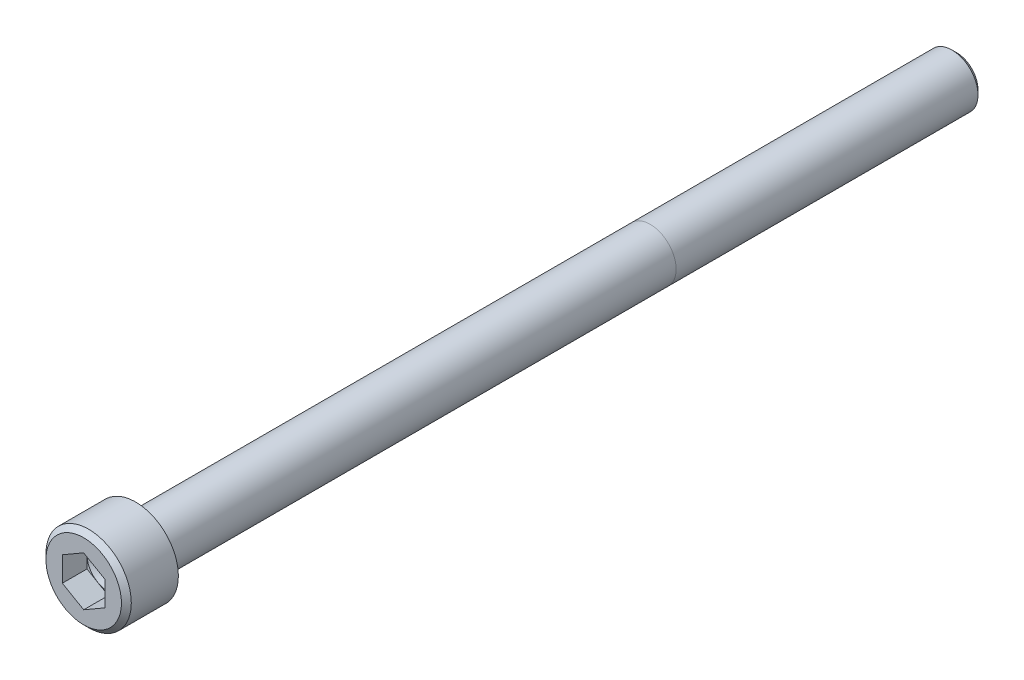
ISO-10303-21;
HEADER;
FILE_DESCRIPTION(('STEP AP214'),'2;1');
FILE_NAME('part.step','',(''),(''),'','','');
FILE_SCHEMA(('AUTOMOTIVE_DESIGN { 1 0 10303 214 1 1 1 1 }'));
ENDSEC;
DATA;
#1=APPLICATION_CONTEXT('core data for automotive mechanical design processes');
#2=APPLICATION_PROTOCOL_DEFINITION('international standard','automotive_design',2000,#1);
#3=PRODUCT_CONTEXT('',#1,'mechanical');
#4=PRODUCT('Part','Part','',(#3));
#5=PRODUCT_RELATED_PRODUCT_CATEGORY('part','',(#4));
#6=PRODUCT_DEFINITION_FORMATION('','',#4);
#7=PRODUCT_DEFINITION_CONTEXT('part definition',#1,'design');
#8=PRODUCT_DEFINITION('design','',#6,#7);
#9=PRODUCT_DEFINITION_SHAPE('','',#8);
#10=(LENGTH_UNIT() NAMED_UNIT(*) SI_UNIT(.MILLI.,.METRE.));
#11=(NAMED_UNIT(*) PLANE_ANGLE_UNIT() SI_UNIT($,.RADIAN.));
#12=(NAMED_UNIT(*) SI_UNIT($,.STERADIAN.) SOLID_ANGLE_UNIT());
#13=UNCERTAINTY_MEASURE_WITH_UNIT(LENGTH_MEASURE(1.E-05),#10,'distance_accuracy_value','');
#14=(GEOMETRIC_REPRESENTATION_CONTEXT(3) GLOBAL_UNCERTAINTY_ASSIGNED_CONTEXT((#13)) GLOBAL_UNIT_ASSIGNED_CONTEXT((#10,
#11,#12)) REPRESENTATION_CONTEXT('',''));
#15=CARTESIAN_POINT('',(0.,0.,0.));
#16=DIRECTION('',(0.,0.,1.));
#17=DIRECTION('',(1.,0.,0.));
#18=AXIS2_PLACEMENT_3D('',#15,#16,#17);
#19=CARTESIAN_POINT('',(0.,0.,-76.2));
#20=DIRECTION('',(0.,0.,1.));
#21=DIRECTION('',(1.,0.,0.));
#22=AXIS2_PLACEMENT_3D('',#19,#20,#21);
#23=CYLINDRICAL_SURFACE('',#22,2.413);
#24=CARTESIAN_POINT('',(0.,0.,-0.152399999999997));
#25=DIRECTION('',(0.,0.,1.));
#26=DIRECTION('',(1.,0.,0.));
#27=AXIS2_PLACEMENT_3D('',#24,#25,#26);
#28=CIRCLE('',#27,2.413);
#29=CARTESIAN_POINT('',(2.413,0.,-0.152399999999997));
#30=VERTEX_POINT('',#29);
#31=EDGE_CURVE('E137',#30,#30,#28,.F.);
#32=ORIENTED_EDGE('',*,*,#31,.T.);
#33=EDGE_LOOP('',(#32));
#34=FACE_BOUND('',#33,.T.);
#35=CARTESIAN_POINT('',(0.,0.,-47.752));
#36=DIRECTION('',(0.,0.,-1.));
#37=DIRECTION('',(-1.,0.,0.));
#38=AXIS2_PLACEMENT_3D('',#35,#36,#37);
#39=CIRCLE('',#38,2.413);
#40=CARTESIAN_POINT('',(-2.413,0.,-47.752));
#41=VERTEX_POINT('',#40);
#42=EDGE_CURVE('E11',#41,#41,#39,.T.);
#43=ORIENTED_EDGE('',*,*,#42,.F.);
#44=EDGE_LOOP('',(#43));
#45=FACE_BOUND('',#44,.T.);
#46=ADVANCED_FACE('F17',(#34,#45),#23,.T.);
#47=CARTESIAN_POINT('',(0.,0.,2.54));
#48=DIRECTION('',(0.,0.,1.));
#49=DIRECTION('',(1.,0.,0.));
#50=AXIS2_PLACEMENT_3D('',#47,#48,#49);
#51=PLANE('',#50);
#52=DIRECTION('',(0.,1.,0.));
#53=VECTOR('',#52,1.);
#54=CARTESIAN_POINT('',(-1.9812,0.,2.54));
#55=LINE('',#54,#53);
#56=CARTESIAN_POINT('',(-1.9812,0.,2.54));
#57=VERTEX_POINT('',#56);
#58=CARTESIAN_POINT('',(-1.9812,1.14384635331849,2.54));
#59=VERTEX_POINT('',#58);
#60=EDGE_CURVE('E194',#57,#59,#55,.T.);
#61=ORIENTED_EDGE('',*,*,#60,.F.);
#62=CARTESIAN_POINT('',(0.,0.,2.54));
#63=DIRECTION('',(0.,0.,-1.));
#64=DIRECTION('',(-1.,0.,0.));
#65=AXIS2_PLACEMENT_3D('',#62,#63,#64);
#66=CIRCLE('',#65,1.9812);
#67=CARTESIAN_POINT('',(-0.9906,1.71576952997773,2.54));
#68=VERTEX_POINT('',#67);
#69=EDGE_CURVE('E32',#57,#68,#66,.T.);
#70=ORIENTED_EDGE('',*,*,#69,.T.);
#71=DIRECTION('',(0.866025403784439,0.5,0.));
#72=VECTOR('',#71,1.);
#73=CARTESIAN_POINT('',(0.163354175866616,2.38200528404682,2.54));
#74=LINE('',#73,#72);
#75=EDGE_CURVE('E195',#59,#68,#74,.T.);
#76=ORIENTED_EDGE('',*,*,#75,.F.);
#77=EDGE_LOOP('',(#61,#70,#76));
#78=FACE_BOUND('',#77,.T.);
#79=ADVANCED_FACE('F105',(#78),#51,.T.);
#80=CARTESIAN_POINT('',(0.,2.28769270663697,2.54));
#81=VERTEX_POINT('',#80);
#82=EDGE_CURVE('E198',#68,#81,#74,.T.);
#83=ORIENTED_EDGE('',*,*,#82,.F.);
#84=CARTESIAN_POINT('',(0.9906,1.71576952997773,2.54));
#85=VERTEX_POINT('',#84);
#86=EDGE_CURVE('E139',#68,#85,#66,.T.);
#87=ORIENTED_EDGE('',*,*,#86,.T.);
#88=DIRECTION('',(0.866025403784439,-0.5,0.));
#89=VECTOR('',#88,1.);
#90=CARTESIAN_POINT('',(-0.163354175866613,2.38200528404682,2.54));
#91=LINE('',#90,#89);
#92=EDGE_CURVE('E199',#81,#85,#91,.T.);
#93=ORIENTED_EDGE('',*,*,#92,.F.);
#94=EDGE_LOOP('',(#83,#87,#93));
#95=FACE_BOUND('',#94,.T.);
#96=ADVANCED_FACE('F111',(#95),#51,.T.);
#97=CARTESIAN_POINT('',(1.9812,1.14384635331848,2.54));
#98=VERTEX_POINT('',#97);
#99=EDGE_CURVE('E166',#85,#98,#91,.T.);
#100=ORIENTED_EDGE('',*,*,#99,.F.);
#101=CARTESIAN_POINT('',(1.9812,0.,2.54));
#102=VERTEX_POINT('',#101);
#103=EDGE_CURVE('E206',#85,#102,#66,.T.);
#104=ORIENTED_EDGE('',*,*,#103,.T.);
#105=DIRECTION('',(0.,-1.,0.));
#106=VECTOR('',#105,1.);
#107=CARTESIAN_POINT('',(1.9812,0.,2.54));
#108=LINE('',#107,#106);
#109=EDGE_CURVE('E162',#98,#102,#108,.T.);
#110=ORIENTED_EDGE('',*,*,#109,.F.);
#111=EDGE_LOOP('',(#100,#104,#110));
#112=FACE_BOUND('',#111,.T.);
#113=ADVANCED_FACE('F223',(#112),#51,.T.);
#114=CARTESIAN_POINT('',(1.9812,-1.14384635331848,2.54));
#115=VERTEX_POINT('',#114);
#116=EDGE_CURVE('E182',#102,#115,#108,.T.);
#117=ORIENTED_EDGE('',*,*,#116,.F.);
#118=CARTESIAN_POINT('',(0.9906,-1.71576952997773,2.54));
#119=VERTEX_POINT('',#118);
#120=EDGE_CURVE('E211',#102,#119,#66,.T.);
#121=ORIENTED_EDGE('',*,*,#120,.T.);
#122=DIRECTION('',(-0.866025403784438,-0.5,0.));
#123=VECTOR('',#122,1.);
#124=CARTESIAN_POINT('',(2.14455417586661,-1.04953377590864,2.54));
#125=LINE('',#124,#123);
#126=EDGE_CURVE('E183',#115,#119,#125,.T.);
#127=ORIENTED_EDGE('',*,*,#126,.F.);
#128=EDGE_LOOP('',(#117,#121,#127));
#129=FACE_BOUND('',#128,.T.);
#130=ADVANCED_FACE('F224',(#129),#51,.T.);
#131=CARTESIAN_POINT('',(0.,-2.28769270663697,2.54));
#132=VERTEX_POINT('',#131);
#133=EDGE_CURVE('E186',#119,#132,#125,.T.);
#134=ORIENTED_EDGE('',*,*,#133,.F.);
#135=CARTESIAN_POINT('',(-0.9906,-1.71576952997773,2.54));
#136=VERTEX_POINT('',#135);
#137=EDGE_CURVE('E207',#119,#136,#66,.T.);
#138=ORIENTED_EDGE('',*,*,#137,.T.);
#139=DIRECTION('',(-0.866025403784439,0.5,0.));
#140=VECTOR('',#139,1.);
#141=CARTESIAN_POINT('',(-2.14455417586661,-1.04953377590865,2.54));
#142=LINE('',#141,#140);
#143=EDGE_CURVE('E187',#132,#136,#142,.T.);
#144=ORIENTED_EDGE('',*,*,#143,.F.);
#145=EDGE_LOOP('',(#134,#138,#144));
#146=FACE_BOUND('',#145,.T.);
#147=ADVANCED_FACE('F124',(#146),#51,.T.);
#148=CARTESIAN_POINT('',(0.,0.,4.826));
#149=DIRECTION('',(0.,0.,1.));
#150=DIRECTION('',(1.,0.,0.));
#151=AXIS2_PLACEMENT_3D('',#148,#149,#150);
#152=PLANE('',#151);
#153=CARTESIAN_POINT('',(0.,0.,4.826));
#154=DIRECTION('',(0.,0.,1.));
#155=DIRECTION('',(1.,0.,0.));
#156=AXIS2_PLACEMENT_3D('',#153,#154,#155);
#157=CIRCLE('',#156,3.5052);
#158=CARTESIAN_POINT('',(3.5052,0.,4.826));
#159=VERTEX_POINT('',#158);
#160=EDGE_CURVE('E144',#159,#159,#157,.T.);
#161=ORIENTED_EDGE('',*,*,#160,.T.);
#162=EDGE_LOOP('',(#161));
#163=FACE_BOUND('',#162,.T.);
#164=DIRECTION('',(0.866025403784439,0.5,0.));
#165=VECTOR('',#164,1.);
#166=CARTESIAN_POINT('',(0.163354175866616,2.38200528404682,4.826));
#167=LINE('',#166,#165);
#168=CARTESIAN_POINT('',(-1.9812,1.14384635331849,4.826));
#169=VERTEX_POINT('',#168);
#170=CARTESIAN_POINT('',(0.,2.28769270663697,4.826));
#171=VERTEX_POINT('',#170);
#172=EDGE_CURVE('E174',#169,#171,#167,.T.);
#173=ORIENTED_EDGE('',*,*,#172,.T.);
#174=DIRECTION('',(0.866025403784439,-0.5,0.));
#175=VECTOR('',#174,1.);
#176=CARTESIAN_POINT('',(-0.163354175866613,2.38200528404682,4.826));
#177=LINE('',#176,#175);
#178=CARTESIAN_POINT('',(1.9812,1.14384635331848,4.826));
#179=VERTEX_POINT('',#178);
#180=EDGE_CURVE('E177',#171,#179,#177,.T.);
#181=ORIENTED_EDGE('',*,*,#180,.T.);
#182=DIRECTION('',(0.,-1.,0.));
#183=VECTOR('',#182,1.);
#184=CARTESIAN_POINT('',(1.9812,0.,4.826));
#185=LINE('',#184,#183);
#186=CARTESIAN_POINT('',(1.9812,-1.14384635331848,4.826));
#187=VERTEX_POINT('',#186);
#188=EDGE_CURVE('E163',#179,#187,#185,.T.);
#189=ORIENTED_EDGE('',*,*,#188,.T.);
#190=DIRECTION('',(-0.866025403784438,-0.5,0.));
#191=VECTOR('',#190,1.);
#192=CARTESIAN_POINT('',(2.14455417586661,-1.04953377590864,4.826));
#193=LINE('',#192,#191);
#194=CARTESIAN_POINT('',(0.,-2.28769270663697,4.826));
#195=VERTEX_POINT('',#194);
#196=EDGE_CURVE('E40',#187,#195,#193,.T.);
#197=ORIENTED_EDGE('',*,*,#196,.T.);
#198=DIRECTION('',(-0.866025403784439,0.5,0.));
#199=VECTOR('',#198,1.);
#200=CARTESIAN_POINT('',(-2.14455417586661,-1.04953377590865,4.826));
#201=LINE('',#200,#199);
#202=CARTESIAN_POINT('',(-1.9812,-1.14384635331849,4.826));
#203=VERTEX_POINT('',#202);
#204=EDGE_CURVE('E168',#195,#203,#201,.T.);
#205=ORIENTED_EDGE('',*,*,#204,.T.);
#206=DIRECTION('',(0.,1.,0.));
#207=VECTOR('',#206,1.);
#208=CARTESIAN_POINT('',(-1.9812,0.,4.826));
#209=LINE('',#208,#207);
#210=EDGE_CURVE('E171',#203,#169,#209,.T.);
#211=ORIENTED_EDGE('',*,*,#210,.T.);
#212=EDGE_LOOP('',(#173,#181,#189,#197,#205,#211));
#213=FACE_BOUND('',#212,.T.);
#214=ADVANCED_FACE('F248',(#163,#213),#152,.T.);
#215=CARTESIAN_POINT('',(0.,0.,4.826));
#216=DIRECTION('',(0.,0.,-1.));
#217=DIRECTION('',(-1.,0.,0.));
#218=AXIS2_PLACEMENT_3D('',#215,#216,#217);
#219=CYLINDRICAL_SURFACE('',#218,3.9624);
#220=CARTESIAN_POINT('',(0.,0.,4.3688));
#221=DIRECTION('',(0.,0.,1.));
#222=DIRECTION('',(1.,0.,0.));
#223=AXIS2_PLACEMENT_3D('',#220,#221,#222);
#224=CIRCLE('',#223,3.9624);
#225=CARTESIAN_POINT('',(3.9624,0.,4.3688));
#226=VERTEX_POINT('',#225);
#227=EDGE_CURVE('E140',#226,#226,#224,.F.);
#228=ORIENTED_EDGE('',*,*,#227,.T.);
#229=EDGE_LOOP('',(#228));
#230=FACE_BOUND('',#229,.T.);
#231=CARTESIAN_POINT('',(0.,0.,0.));
#232=DIRECTION('',(0.,0.,1.));
#233=DIRECTION('',(1.,0.,0.));
#234=AXIS2_PLACEMENT_3D('',#231,#232,#233);
#235=CIRCLE('',#234,3.9624);
#236=CARTESIAN_POINT('',(3.9624,0.,0.));
#237=VERTEX_POINT('',#236);
#238=EDGE_CURVE('E147',#237,#237,#235,.T.);
#239=ORIENTED_EDGE('',*,*,#238,.T.);
#240=EDGE_LOOP('',(#239));
#241=FACE_BOUND('',#240,.T.);
#242=ADVANCED_FACE('F250',(#230,#241),#219,.T.);
#243=CARTESIAN_POINT('',(0.,0.,0.));
#244=DIRECTION('',(0.,0.,1.));
#245=DIRECTION('',(1.,0.,0.));
#246=AXIS2_PLACEMENT_3D('',#243,#244,#245);
#247=PLANE('',#246);
#248=CARTESIAN_POINT('',(0.,0.,0.));
#249=DIRECTION('',(0.,0.,1.));
#250=DIRECTION('',(1.,0.,0.));
#251=AXIS2_PLACEMENT_3D('',#248,#249,#250);
#252=CIRCLE('',#251,2.5654);
#253=CARTESIAN_POINT('',(2.5654,0.,0.));
#254=VERTEX_POINT('',#253);
#255=EDGE_CURVE('E132',#254,#254,#252,.T.);
#256=ORIENTED_EDGE('',*,*,#255,.T.);
#257=EDGE_LOOP('',(#256));
#258=FACE_BOUND('',#257,.T.);
#259=ORIENTED_EDGE('',*,*,#238,.F.);
#260=EDGE_LOOP('',(#259));
#261=FACE_BOUND('',#260,.T.);
#262=ADVANCED_FACE('F257',(#258,#261),#247,.F.);
#263=CARTESIAN_POINT('',(0.,0.,4.826));
#264=DIRECTION('',(0.,0.,-1.));
#265=DIRECTION('',(-1.,0.,0.));
#266=AXIS2_PLACEMENT_3D('',#263,#264,#265);
#267=CONICAL_SURFACE('',#266,3.5052,0.785398163397449);
#268=ORIENTED_EDGE('',*,*,#227,.F.);
#269=EDGE_LOOP('',(#268));
#270=FACE_BOUND('',#269,.T.);
#271=ORIENTED_EDGE('',*,*,#160,.F.);
#272=EDGE_LOOP('',(#271));
#273=FACE_BOUND('',#272,.T.);
#274=ADVANCED_FACE('F264',(#270,#273),#267,.T.);
#275=CARTESIAN_POINT('',(-0.163354175866613,2.38200528404682,2.54));
#276=DIRECTION('',(-0.5,-0.866025403784439,0.));
#277=DIRECTION('',(0.866025403784439,-0.5,0.));
#278=AXIS2_PLACEMENT_3D('',#275,#276,#277);
#279=PLANE('',#278);
#280=ORIENTED_EDGE('',*,*,#180,.F.);
#281=DIRECTION('',(0.,0.,1.));
#282=VECTOR('',#281,1.);
#283=CARTESIAN_POINT('',(0.,2.28769270663697,2.54));
#284=LINE('',#283,#282);
#285=EDGE_CURVE('E150',#81,#171,#284,.T.);
#286=ORIENTED_EDGE('',*,*,#285,.F.);
#287=ORIENTED_EDGE('',*,*,#92,.T.);
#288=ORIENTED_EDGE('',*,*,#99,.T.);
#289=DIRECTION('',(0.,0.,1.));
#290=VECTOR('',#289,1.);
#291=CARTESIAN_POINT('',(1.9812,1.14384635331848,2.54));
#292=LINE('',#291,#290);
#293=EDGE_CURVE('E160',#98,#179,#292,.T.);
#294=ORIENTED_EDGE('',*,*,#293,.T.);
#295=EDGE_LOOP('',(#280,#286,#287,#288,#294));
#296=FACE_BOUND('',#295,.T.);
#297=ADVANCED_FACE('F230',(#296),#279,.T.);
#298=CARTESIAN_POINT('',(0.163354175866616,2.38200528404682,2.54));
#299=DIRECTION('',(0.5,-0.866025403784438,0.));
#300=DIRECTION('',(0.866025403784438,0.5,0.));
#301=AXIS2_PLACEMENT_3D('',#298,#299,#300);
#302=PLANE('',#301);
#303=ORIENTED_EDGE('',*,*,#172,.F.);
#304=DIRECTION('',(0.,0.,1.));
#305=VECTOR('',#304,1.);
#306=CARTESIAN_POINT('',(-1.9812,1.14384635331849,2.54));
#307=LINE('',#306,#305);
#308=EDGE_CURVE('E152',#59,#169,#307,.T.);
#309=ORIENTED_EDGE('',*,*,#308,.F.);
#310=ORIENTED_EDGE('',*,*,#75,.T.);
#311=ORIENTED_EDGE('',*,*,#82,.T.);
#312=ORIENTED_EDGE('',*,*,#285,.T.);
#313=EDGE_LOOP('',(#303,#309,#310,#311,#312));
#314=FACE_BOUND('',#313,.T.);
#315=ADVANCED_FACE('F237',(#314),#302,.T.);
#316=CARTESIAN_POINT('',(-1.9812,0.,2.54));
#317=DIRECTION('',(1.,0.,0.));
#318=DIRECTION('',(0.,0.,-1.));
#319=AXIS2_PLACEMENT_3D('',#316,#317,#318);
#320=PLANE('',#319);
#321=ORIENTED_EDGE('',*,*,#210,.F.);
#322=DIRECTION('',(0.,0.,1.));
#323=VECTOR('',#322,1.);
#324=CARTESIAN_POINT('',(-1.9812,-1.14384635331849,2.54));
#325=LINE('',#324,#323);
#326=CARTESIAN_POINT('',(-1.9812,-1.14384635331849,2.54));
#327=VERTEX_POINT('',#326);
#328=EDGE_CURVE('E154',#327,#203,#325,.T.);
#329=ORIENTED_EDGE('',*,*,#328,.F.);
#330=EDGE_CURVE('E191',#327,#57,#55,.T.);
#331=ORIENTED_EDGE('',*,*,#330,.T.);
#332=ORIENTED_EDGE('',*,*,#60,.T.);
#333=ORIENTED_EDGE('',*,*,#308,.T.);
#334=EDGE_LOOP('',(#321,#329,#331,#332,#333));
#335=FACE_BOUND('',#334,.T.);
#336=ADVANCED_FACE('F241',(#335),#320,.T.);
#337=CARTESIAN_POINT('',(-2.14455417586661,-1.04953377590865,2.54));
#338=DIRECTION('',(0.5,0.866025403784439,0.));
#339=DIRECTION('',(-0.866025403784439,0.5,0.));
#340=AXIS2_PLACEMENT_3D('',#337,#338,#339);
#341=PLANE('',#340);
#342=ORIENTED_EDGE('',*,*,#204,.F.);
#343=DIRECTION('',(0.,0.,1.));
#344=VECTOR('',#343,1.);
#345=CARTESIAN_POINT('',(0.,-2.28769270663697,2.54));
#346=LINE('',#345,#344);
#347=EDGE_CURVE('E156',#132,#195,#346,.T.);
#348=ORIENTED_EDGE('',*,*,#347,.F.);
#349=ORIENTED_EDGE('',*,*,#143,.T.);
#350=EDGE_CURVE('E190',#136,#327,#142,.T.);
#351=ORIENTED_EDGE('',*,*,#350,.T.);
#352=ORIENTED_EDGE('',*,*,#328,.T.);
#353=EDGE_LOOP('',(#342,#348,#349,#351,#352));
#354=FACE_BOUND('',#353,.T.);
#355=ADVANCED_FACE('F245',(#354),#341,.T.);
#356=CARTESIAN_POINT('',(2.14455417586661,-1.04953377590864,2.54));
#357=DIRECTION('',(-0.5,0.866025403784438,0.));
#358=DIRECTION('',(-0.866025403784438,-0.5,0.));
#359=AXIS2_PLACEMENT_3D('',#356,#357,#358);
#360=PLANE('',#359);
#361=ORIENTED_EDGE('',*,*,#196,.F.);
#362=DIRECTION('',(0.,0.,1.));
#363=VECTOR('',#362,1.);
#364=CARTESIAN_POINT('',(1.9812,-1.14384635331848,2.54));
#365=LINE('',#364,#363);
#366=EDGE_CURVE('E158',#115,#187,#365,.T.);
#367=ORIENTED_EDGE('',*,*,#366,.F.);
#368=ORIENTED_EDGE('',*,*,#126,.T.);
#369=ORIENTED_EDGE('',*,*,#133,.T.);
#370=ORIENTED_EDGE('',*,*,#347,.T.);
#371=EDGE_LOOP('',(#361,#367,#368,#369,#370));
#372=FACE_BOUND('',#371,.T.);
#373=ADVANCED_FACE('F246',(#372),#360,.T.);
#374=CARTESIAN_POINT('',(1.9812,0.,2.54));
#375=DIRECTION('',(-1.,0.,0.));
#376=DIRECTION('',(0.,0.,1.));
#377=AXIS2_PLACEMENT_3D('',#374,#375,#376);
#378=PLANE('',#377);
#379=ORIENTED_EDGE('',*,*,#188,.F.);
#380=ORIENTED_EDGE('',*,*,#293,.F.);
#381=ORIENTED_EDGE('',*,*,#109,.T.);
#382=ORIENTED_EDGE('',*,*,#116,.T.);
#383=ORIENTED_EDGE('',*,*,#366,.T.);
#384=EDGE_LOOP('',(#379,#380,#381,#382,#383));
#385=FACE_BOUND('',#384,.T.);
#386=ADVANCED_FACE('F122',(#385),#378,.T.);
#387=ORIENTED_EDGE('',*,*,#350,.F.);
#388=EDGE_CURVE('E143',#136,#57,#66,.T.);
#389=ORIENTED_EDGE('',*,*,#388,.T.);
#390=ORIENTED_EDGE('',*,*,#330,.F.);
#391=EDGE_LOOP('',(#387,#389,#390));
#392=FACE_BOUND('',#391,.T.);
#393=ADVANCED_FACE('F114',(#392),#51,.T.);
#394=ORIENTED_EDGE('',*,*,#42,.T.);
#395=EDGE_LOOP('',(#394));
#396=FACE_BOUND('',#395,.T.);
#397=CARTESIAN_POINT('',(0.,0.,-75.77105761938));
#398=DIRECTION('',(0.,0.,-1.));
#399=DIRECTION('',(-1.,0.,0.));
#400=AXIS2_PLACEMENT_3D('',#397,#398,#399);
#401=CIRCLE('',#400,2.413);
#402=CARTESIAN_POINT('',(-2.413,0.,-75.77105761938));
#403=VERTEX_POINT('',#402);
#404=EDGE_CURVE('E25',#403,#403,#401,.F.);
#405=ORIENTED_EDGE('',*,*,#404,.T.);
#406=EDGE_LOOP('',(#405));
#407=FACE_BOUND('',#406,.T.);
#408=ADVANCED_FACE('F101',(#396,#407),#23,.T.);
#409=CARTESIAN_POINT('',(0.,0.,-76.2));
#410=DIRECTION('',(0.,0.,-1.));
#411=DIRECTION('',(1.,0.,0.));
#412=AXIS2_PLACEMENT_3D('',#409,#410,#411);
#413=PLANE('',#412);
#414=CARTESIAN_POINT('',(0.,0.,-76.2));
#415=DIRECTION('',(0.,0.,-1.));
#416=DIRECTION('',(-1.,0.,0.));
#417=AXIS2_PLACEMENT_3D('',#414,#415,#416);
#418=CIRCLE('',#417,1.98405761938);
#419=CARTESIAN_POINT('',(-1.98405761938,0.,-76.2));
#420=VERTEX_POINT('',#419);
#421=EDGE_CURVE('E130',#420,#420,#418,.T.);
#422=ORIENTED_EDGE('',*,*,#421,.T.);
#423=EDGE_LOOP('',(#422));
#424=FACE_BOUND('',#423,.T.);
#425=ADVANCED_FACE('F93',(#424),#413,.T.);
#426=CARTESIAN_POINT('',(0.,0.,1.39615364668151));
#427=DIRECTION('',(0.,0.,1.));
#428=DIRECTION('',(1.,0.,0.));
#429=AXIS2_PLACEMENT_3D('',#426,#427,#428);
#430=CONICAL_SURFACE('',#429,0.,1.0471975511966);
#431=ORIENTED_EDGE('',*,*,#69,.F.);
#432=ORIENTED_EDGE('',*,*,#388,.F.);
#433=ORIENTED_EDGE('',*,*,#137,.F.);
#434=ORIENTED_EDGE('',*,*,#120,.F.);
#435=ORIENTED_EDGE('',*,*,#103,.F.);
#436=ORIENTED_EDGE('',*,*,#86,.F.);
#437=EDGE_LOOP('',(#431,#432,#433,#434,#435,#436));
#438=FACE_BOUND('',#437,.T.);
#439=CARTESIAN_POINT('',(0.,0.,1.39615364668151));
#440=VERTEX_POINT('',#439);
#441=VERTEX_LOOP('',#440);
#442=FACE_BOUND('',#441,.T.);
#443=ADVANCED_FACE('F90',(#438,#442),#430,.F.);
#444=CARTESIAN_POINT('',(0.,0.,-0.152399999999997));
#445=DIRECTION('',(0.,0.,1.));
#446=DIRECTION('',(1.,0.,0.));
#447=AXIS2_PLACEMENT_3D('',#444,#445,#446);
#448=TOROIDAL_SURFACE('',#447,2.5654,0.1524);
#449=ORIENTED_EDGE('',*,*,#255,.F.);
#450=EDGE_LOOP('',(#449));
#451=FACE_BOUND('',#450,.T.);
#452=ORIENTED_EDGE('',*,*,#31,.F.);
#453=EDGE_LOOP('',(#452));
#454=FACE_BOUND('',#453,.T.);
#455=ADVANCED_FACE('F92',(#451,#454),#448,.F.);
#456=CARTESIAN_POINT('',(0.,0.,-76.2));
#457=DIRECTION('',(0.,0.,1.));
#458=DIRECTION('',(1.,0.,0.));
#459=AXIS2_PLACEMENT_3D('',#456,#457,#458);
#460=CONICAL_SURFACE('',#459,1.98405761938,0.785398163397453);
#461=ORIENTED_EDGE('',*,*,#404,.F.);
#462=EDGE_LOOP('',(#461));
#463=FACE_BOUND('',#462,.T.);
#464=ORIENTED_EDGE('',*,*,#421,.F.);
#465=EDGE_LOOP('',(#464));
#466=FACE_BOUND('',#465,.T.);
#467=ADVANCED_FACE('F19',(#463,#466),#460,.T.);
#468=CLOSED_SHELL('',(#46,#79,#96,#113,#130,#147,#214,#242,#262,#274,#297,#315,#336,#355,#373,
#386,#393,#408,#425,#443,#455,#467));
#469=MANIFOLD_SOLID_BREP('B1',#468);
#470=ADVANCED_BREP_SHAPE_REPRESENTATION('',(#18,#469),#14);
#471=SHAPE_DEFINITION_REPRESENTATION(#9,#470);
ENDSEC;
END-ISO-10303-21;
